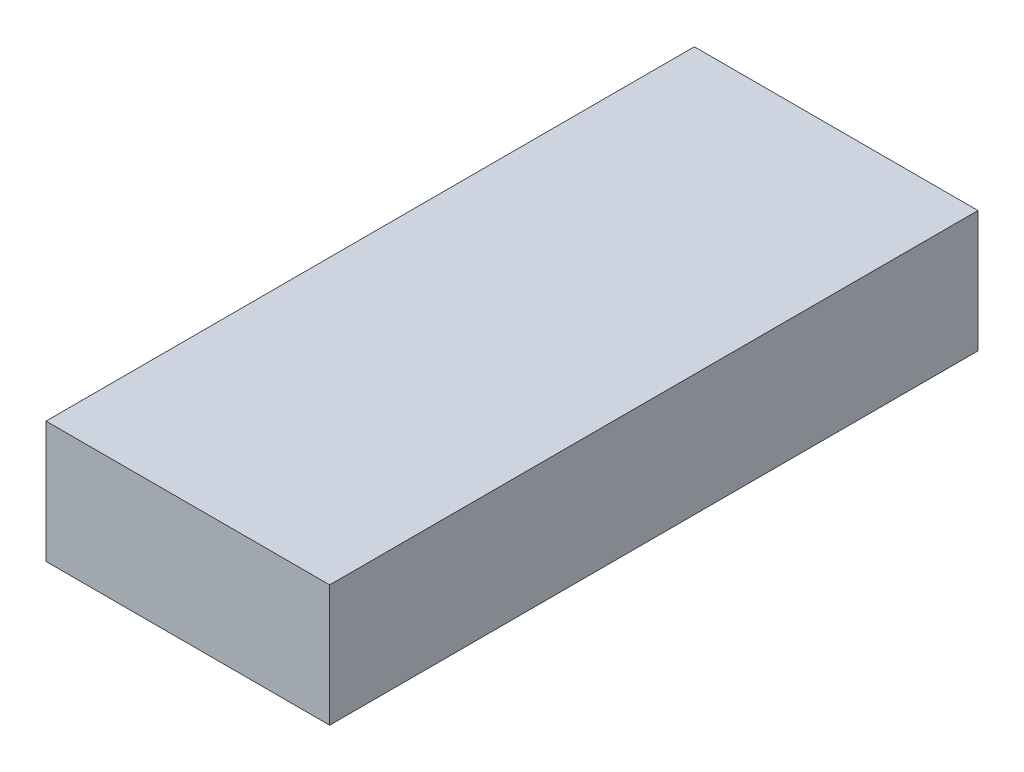
ISO-10303-21;
HEADER;
FILE_DESCRIPTION(('STEP AP214'),'2;1');
FILE_NAME('part.step','',(''),(''),'','','');
FILE_SCHEMA(('AUTOMOTIVE_DESIGN { 1 0 10303 214 1 1 1 1 }'));
ENDSEC;
DATA;
#1=APPLICATION_CONTEXT('core data for automotive mechanical design processes');
#2=APPLICATION_PROTOCOL_DEFINITION('international standard','automotive_design',2000,#1);
#3=PRODUCT_CONTEXT('',#1,'mechanical');
#4=PRODUCT('Part','Part','',(#3));
#5=PRODUCT_RELATED_PRODUCT_CATEGORY('part','',(#4));
#6=PRODUCT_DEFINITION_FORMATION('','',#4);
#7=PRODUCT_DEFINITION_CONTEXT('part definition',#1,'design');
#8=PRODUCT_DEFINITION('design','',#6,#7);
#9=PRODUCT_DEFINITION_SHAPE('','',#8);
#10=(LENGTH_UNIT() NAMED_UNIT(*) SI_UNIT(.MILLI.,.METRE.));
#11=(NAMED_UNIT(*) PLANE_ANGLE_UNIT() SI_UNIT($,.RADIAN.));
#12=(NAMED_UNIT(*) SI_UNIT($,.STERADIAN.) SOLID_ANGLE_UNIT());
#13=UNCERTAINTY_MEASURE_WITH_UNIT(LENGTH_MEASURE(1.E-05),#10,'distance_accuracy_value','');
#14=(GEOMETRIC_REPRESENTATION_CONTEXT(3) GLOBAL_UNCERTAINTY_ASSIGNED_CONTEXT((#13)) GLOBAL_UNIT_ASSIGNED_CONTEXT((#10,
#11,#12)) REPRESENTATION_CONTEXT('',''));
#15=CARTESIAN_POINT('',(0.,0.,0.));
#16=DIRECTION('',(0.,0.,1.));
#17=DIRECTION('',(1.,0.,0.));
#18=AXIS2_PLACEMENT_3D('',#15,#16,#17);
#19=CARTESIAN_POINT('',(35.01,165.01,535.));
#20=DIRECTION('',(0.,0.,-1.));
#21=DIRECTION('',(0.,-1.,0.));
#22=AXIS2_PLACEMENT_3D('',#19,#20,#21);
#23=PLANE('',#22);
#24=DIRECTION('',(0.,1.,0.));
#25=VECTOR('',#24,1.);
#26=CARTESIAN_POINT('',(35.,157.5,535.));
#27=LINE('',#26,#25);
#28=CARTESIAN_POINT('',(35.,150.,535.));
#29=VERTEX_POINT('',#28);
#30=CARTESIAN_POINT('',(35.,165.,535.));
#31=VERTEX_POINT('',#30);
#32=EDGE_CURVE('E56',#29,#31,#27,.T.);
#33=ORIENTED_EDGE('',*,*,#32,.F.);
#34=DIRECTION('',(1.,0.,0.));
#35=VECTOR('',#34,1.);
#36=CARTESIAN_POINT('',(17.5,150.,535.));
#37=LINE('',#36,#35);
#38=CARTESIAN_POINT('',(0.,150.,535.));
#39=VERTEX_POINT('',#38);
#40=EDGE_CURVE('E68',#39,#29,#37,.T.);
#41=ORIENTED_EDGE('',*,*,#40,.F.);
#42=DIRECTION('',(0.,-1.,0.));
#43=VECTOR('',#42,1.);
#44=CARTESIAN_POINT('',(0.,157.5,535.));
#45=LINE('',#44,#43);
#46=CARTESIAN_POINT('',(0.,165.,535.));
#47=VERTEX_POINT('',#46);
#48=EDGE_CURVE('E21',#47,#39,#45,.T.);
#49=ORIENTED_EDGE('',*,*,#48,.F.);
#50=DIRECTION('',(-1.,0.,0.));
#51=VECTOR('',#50,1.);
#52=CARTESIAN_POINT('',(17.5,165.,535.));
#53=LINE('',#52,#51);
#54=EDGE_CURVE('E82',#31,#47,#53,.T.);
#55=ORIENTED_EDGE('',*,*,#54,.F.);
#56=EDGE_LOOP('',(#33,#41,#49,#55));
#57=FACE_BOUND('',#56,.T.);
#58=ADVANCED_FACE('F17',(#57),#23,.T.);
#59=CARTESIAN_POINT('',(0.,149.99,534.99));
#60=DIRECTION('',(-1.,0.,0.));
#61=DIRECTION('',(0.,0.,1.));
#62=AXIS2_PLACEMENT_3D('',#59,#60,#61);
#63=PLANE('',#62);
#64=DIRECTION('',(0.,0.,1.));
#65=VECTOR('',#64,1.);
#66=CARTESIAN_POINT('',(0.,165.,575.));
#67=LINE('',#66,#65);
#68=CARTESIAN_POINT('',(0.,165.,615.));
#69=VERTEX_POINT('',#68);
#70=EDGE_CURVE('E66',#47,#69,#67,.T.);
#71=ORIENTED_EDGE('',*,*,#70,.F.);
#72=ORIENTED_EDGE('',*,*,#48,.T.);
#73=DIRECTION('',(0.,0.,-1.));
#74=VECTOR('',#73,1.);
#75=CARTESIAN_POINT('',(0.,150.,575.));
#76=LINE('',#75,#74);
#77=CARTESIAN_POINT('',(0.,150.,615.));
#78=VERTEX_POINT('',#77);
#79=EDGE_CURVE('E63',#78,#39,#76,.T.);
#80=ORIENTED_EDGE('',*,*,#79,.F.);
#81=DIRECTION('',(0.,-1.,0.));
#82=VECTOR('',#81,1.);
#83=CARTESIAN_POINT('',(0.,157.5,615.));
#84=LINE('',#83,#82);
#85=EDGE_CURVE('E84',#69,#78,#84,.T.);
#86=ORIENTED_EDGE('',*,*,#85,.F.);
#87=EDGE_LOOP('',(#71,#72,#80,#86));
#88=FACE_BOUND('',#87,.T.);
#89=ADVANCED_FACE('F61',(#88),#63,.T.);
#90=CARTESIAN_POINT('',(35.01,150.,534.99));
#91=DIRECTION('',(0.,-1.,0.));
#92=DIRECTION('',(0.,0.,1.));
#93=AXIS2_PLACEMENT_3D('',#90,#91,#92);
#94=PLANE('',#93);
#95=DIRECTION('',(0.,0.,-1.));
#96=VECTOR('',#95,1.);
#97=CARTESIAN_POINT('',(35.,150.,575.));
#98=LINE('',#97,#96);
#99=CARTESIAN_POINT('',(35.,150.,615.));
#100=VERTEX_POINT('',#99);
#101=EDGE_CURVE('E78',#100,#29,#98,.T.);
#102=ORIENTED_EDGE('',*,*,#101,.F.);
#103=DIRECTION('',(1.,0.,0.));
#104=VECTOR('',#103,1.);
#105=CARTESIAN_POINT('',(17.5,150.,615.));
#106=LINE('',#105,#104);
#107=EDGE_CURVE('E74',#78,#100,#106,.T.);
#108=ORIENTED_EDGE('',*,*,#107,.F.);
#109=ORIENTED_EDGE('',*,*,#79,.T.);
#110=ORIENTED_EDGE('',*,*,#40,.T.);
#111=EDGE_LOOP('',(#102,#108,#109,#110));
#112=FACE_BOUND('',#111,.T.);
#113=ADVANCED_FACE('F72',(#112),#94,.T.);
#114=CARTESIAN_POINT('',(35.,149.99,615.01));
#115=DIRECTION('',(1.,0.,0.));
#116=DIRECTION('',(0.,0.,-1.));
#117=AXIS2_PLACEMENT_3D('',#114,#115,#116);
#118=PLANE('',#117);
#119=DIRECTION('',(0.,1.,0.));
#120=VECTOR('',#119,1.);
#121=CARTESIAN_POINT('',(35.,157.5,615.));
#122=LINE('',#121,#120);
#123=CARTESIAN_POINT('',(35.,165.,615.));
#124=VERTEX_POINT('',#123);
#125=EDGE_CURVE('E27',#100,#124,#122,.T.);
#126=ORIENTED_EDGE('',*,*,#125,.F.);
#127=ORIENTED_EDGE('',*,*,#101,.T.);
#128=ORIENTED_EDGE('',*,*,#32,.T.);
#129=DIRECTION('',(0.,0.,-1.));
#130=VECTOR('',#129,1.);
#131=CARTESIAN_POINT('',(35.,165.,575.));
#132=LINE('',#131,#130);
#133=EDGE_CURVE('E36',#124,#31,#132,.T.);
#134=ORIENTED_EDGE('',*,*,#133,.F.);
#135=EDGE_LOOP('',(#126,#127,#128,#134));
#136=FACE_BOUND('',#135,.T.);
#137=ADVANCED_FACE('F89',(#136),#118,.T.);
#138=CARTESIAN_POINT('',(35.01,165.,615.01));
#139=DIRECTION('',(0.,1.,0.));
#140=DIRECTION('',(0.,0.,-1.));
#141=AXIS2_PLACEMENT_3D('',#138,#139,#140);
#142=PLANE('',#141);
#143=ORIENTED_EDGE('',*,*,#133,.T.);
#144=ORIENTED_EDGE('',*,*,#54,.T.);
#145=ORIENTED_EDGE('',*,*,#70,.T.);
#146=DIRECTION('',(-1.,0.,0.));
#147=VECTOR('',#146,1.);
#148=CARTESIAN_POINT('',(17.5,165.,615.));
#149=LINE('',#148,#147);
#150=EDGE_CURVE('E11',#124,#69,#149,.T.);
#151=ORIENTED_EDGE('',*,*,#150,.F.);
#152=EDGE_LOOP('',(#143,#144,#145,#151));
#153=FACE_BOUND('',#152,.T.);
#154=ADVANCED_FACE('F91',(#153),#142,.T.);
#155=CARTESIAN_POINT('',(35.01,149.99,615.));
#156=DIRECTION('',(0.,0.,1.));
#157=DIRECTION('',(0.,1.,0.));
#158=AXIS2_PLACEMENT_3D('',#155,#156,#157);
#159=PLANE('',#158);
#160=ORIENTED_EDGE('',*,*,#125,.T.);
#161=ORIENTED_EDGE('',*,*,#150,.T.);
#162=ORIENTED_EDGE('',*,*,#85,.T.);
#163=ORIENTED_EDGE('',*,*,#107,.T.);
#164=EDGE_LOOP('',(#160,#161,#162,#163));
#165=FACE_BOUND('',#164,.T.);
#166=ADVANCED_FACE('F19',(#165),#159,.T.);
#167=CLOSED_SHELL('',(#58,#89,#113,#137,#154,#166));
#168=MANIFOLD_SOLID_BREP('B1',#167);
#169=ADVANCED_BREP_SHAPE_REPRESENTATION('',(#18,#168),#14);
#170=SHAPE_DEFINITION_REPRESENTATION(#9,#169);
ENDSEC;
END-ISO-10303-21;
